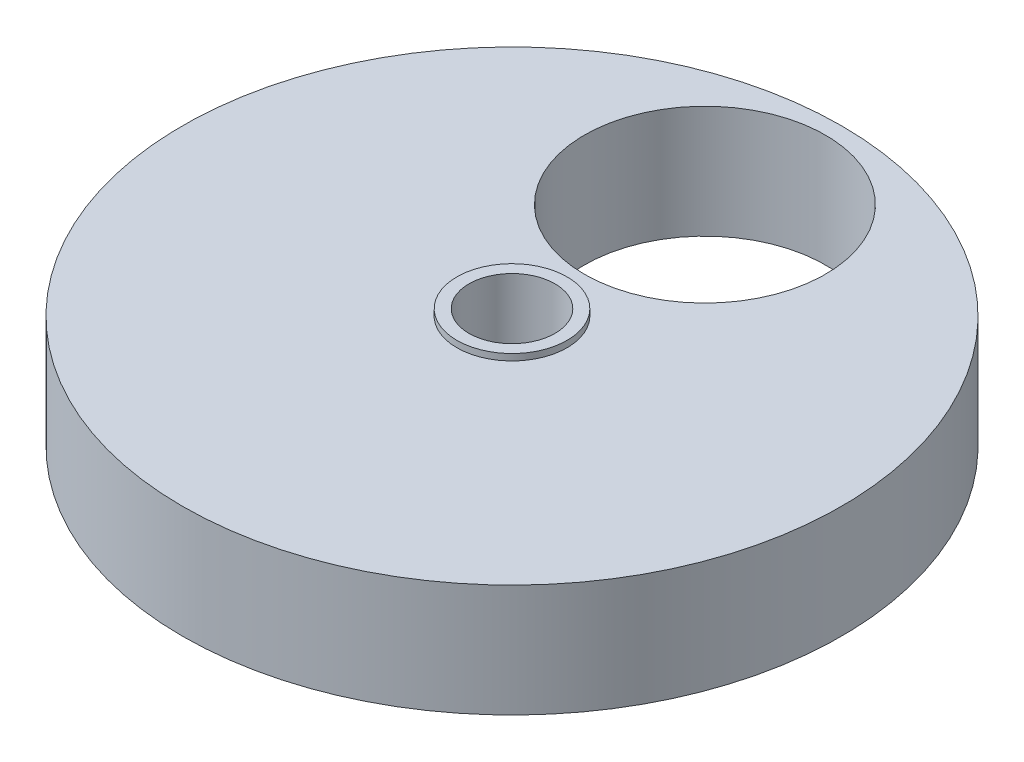
ISO-10303-21;
HEADER;
FILE_DESCRIPTION(('STEP AP214'),'2;1');
FILE_NAME('part.step','',(''),(''),'','','');
FILE_SCHEMA(('AUTOMOTIVE_DESIGN { 1 0 10303 214 1 1 1 1 }'));
ENDSEC;
DATA;
#1=APPLICATION_CONTEXT('core data for automotive mechanical design processes');
#2=APPLICATION_PROTOCOL_DEFINITION('international standard','automotive_design',2000,#1);
#3=PRODUCT_CONTEXT('',#1,'mechanical');
#4=PRODUCT('Part','Part','',(#3));
#5=PRODUCT_RELATED_PRODUCT_CATEGORY('part','',(#4));
#6=PRODUCT_DEFINITION_FORMATION('','',#4);
#7=PRODUCT_DEFINITION_CONTEXT('part definition',#1,'design');
#8=PRODUCT_DEFINITION('design','',#6,#7);
#9=PRODUCT_DEFINITION_SHAPE('','',#8);
#10=(LENGTH_UNIT() NAMED_UNIT(*) SI_UNIT(.MILLI.,.METRE.));
#11=(NAMED_UNIT(*) PLANE_ANGLE_UNIT() SI_UNIT($,.RADIAN.));
#12=(NAMED_UNIT(*) SI_UNIT($,.STERADIAN.) SOLID_ANGLE_UNIT());
#13=UNCERTAINTY_MEASURE_WITH_UNIT(LENGTH_MEASURE(1.E-05),#10,'distance_accuracy_value','');
#14=(GEOMETRIC_REPRESENTATION_CONTEXT(3) GLOBAL_UNCERTAINTY_ASSIGNED_CONTEXT((#13)) GLOBAL_UNIT_ASSIGNED_CONTEXT((#10,
#11,#12)) REPRESENTATION_CONTEXT('',''));
#15=CARTESIAN_POINT('',(0.,0.,0.));
#16=DIRECTION('',(0.,0.,1.));
#17=DIRECTION('',(1.,0.,0.));
#18=AXIS2_PLACEMENT_3D('',#15,#16,#17);
#19=CARTESIAN_POINT('',(0.,7.,0.));
#20=DIRECTION('',(0.,1.,0.));
#21=DIRECTION('',(0.,0.,1.));
#22=AXIS2_PLACEMENT_3D('',#19,#20,#21);
#23=PLANE('',#22);
#24=CARTESIAN_POINT('',(0.,7.,-12.));
#25=DIRECTION('',(0.,1.,0.));
#26=DIRECTION('',(0.,0.,1.));
#27=AXIS2_PLACEMENT_3D('',#24,#25,#26);
#28=CIRCLE('',#27,7.5);
#29=CARTESIAN_POINT('',(0.,7.,-4.5));
#30=VERTEX_POINT('',#29);
#31=EDGE_CURVE('E68',#30,#30,#28,.T.);
#32=ORIENTED_EDGE('',*,*,#31,.F.);
#33=EDGE_LOOP('',(#32));
#34=FACE_BOUND('',#33,.T.);
#35=CARTESIAN_POINT('',(0.,7.,0.));
#36=DIRECTION('',(0.,1.,0.));
#37=DIRECTION('',(0.,0.,1.));
#38=AXIS2_PLACEMENT_3D('',#35,#36,#37);
#39=CIRCLE('',#38,20.5);
#40=CARTESIAN_POINT('',(0.,7.,20.5));
#41=VERTEX_POINT('',#40);
#42=EDGE_CURVE('E10',#41,#41,#39,.T.);
#43=ORIENTED_EDGE('',*,*,#42,.T.);
#44=EDGE_LOOP('',(#43));
#45=FACE_BOUND('',#44,.T.);
#46=CARTESIAN_POINT('',(0.,7.,0.));
#47=DIRECTION('',(0.,1.,0.));
#48=DIRECTION('',(0.,0.,1.));
#49=AXIS2_PLACEMENT_3D('',#46,#47,#48);
#50=CIRCLE('',#49,3.425);
#51=CARTESIAN_POINT('',(0.,7.,3.425));
#52=VERTEX_POINT('',#51);
#53=EDGE_CURVE('E56',#52,#52,#50,.T.);
#54=ORIENTED_EDGE('',*,*,#53,.F.);
#55=EDGE_LOOP('',(#54));
#56=FACE_BOUND('',#55,.T.);
#57=ADVANCED_FACE('F37',(#34,#45,#56),#23,.T.);
#58=CARTESIAN_POINT('',(0.,7.,0.));
#59=DIRECTION('',(0.,-1.,0.));
#60=DIRECTION('',(0.,0.,-1.));
#61=AXIS2_PLACEMENT_3D('',#58,#59,#60);
#62=CYLINDRICAL_SURFACE('',#61,20.5);
#63=ORIENTED_EDGE('',*,*,#42,.F.);
#64=EDGE_LOOP('',(#63));
#65=FACE_BOUND('',#64,.T.);
#66=CARTESIAN_POINT('',(0.,0.,0.));
#67=DIRECTION('',(0.,1.,0.));
#68=DIRECTION('',(0.,0.,1.));
#69=AXIS2_PLACEMENT_3D('',#66,#67,#68);
#70=CIRCLE('',#69,20.5);
#71=CARTESIAN_POINT('',(0.,0.,20.5));
#72=VERTEX_POINT('',#71);
#73=EDGE_CURVE('E41',#72,#72,#70,.T.);
#74=ORIENTED_EDGE('',*,*,#73,.T.);
#75=EDGE_LOOP('',(#74));
#76=FACE_BOUND('',#75,.T.);
#77=ADVANCED_FACE('F39',(#65,#76),#62,.T.);
#78=CARTESIAN_POINT('',(0.,0.,0.));
#79=DIRECTION('',(0.,1.,0.));
#80=DIRECTION('',(0.,0.,1.));
#81=AXIS2_PLACEMENT_3D('',#78,#79,#80);
#82=PLANE('',#81);
#83=CARTESIAN_POINT('',(0.,0.,-12.));
#84=DIRECTION('',(0.,1.,0.));
#85=DIRECTION('',(0.,0.,1.));
#86=AXIS2_PLACEMENT_3D('',#83,#84,#85);
#87=CIRCLE('',#86,7.5);
#88=CARTESIAN_POINT('',(0.,0.,-4.5));
#89=VERTEX_POINT('',#88);
#90=EDGE_CURVE('E67',#89,#89,#87,.T.);
#91=ORIENTED_EDGE('',*,*,#90,.T.);
#92=EDGE_LOOP('',(#91));
#93=FACE_BOUND('',#92,.T.);
#94=CARTESIAN_POINT('',(0.,0.,0.));
#95=DIRECTION('',(0.,1.,0.));
#96=DIRECTION('',(0.,0.,1.));
#97=AXIS2_PLACEMENT_3D('',#94,#95,#96);
#98=CIRCLE('',#97,2.675);
#99=CARTESIAN_POINT('',(0.,0.,2.675));
#100=VERTEX_POINT('',#99);
#101=EDGE_CURVE('E50',#100,#100,#98,.T.);
#102=ORIENTED_EDGE('',*,*,#101,.T.);
#103=EDGE_LOOP('',(#102));
#104=FACE_BOUND('',#103,.T.);
#105=ORIENTED_EDGE('',*,*,#73,.F.);
#106=EDGE_LOOP('',(#105));
#107=FACE_BOUND('',#106,.T.);
#108=ADVANCED_FACE('F76',(#93,#104,#107),#82,.F.);
#109=CARTESIAN_POINT('',(0.,0.,0.));
#110=DIRECTION('',(0.,1.,0.));
#111=DIRECTION('',(0.,0.,1.));
#112=AXIS2_PLACEMENT_3D('',#109,#110,#111);
#113=CYLINDRICAL_SURFACE('',#112,2.675);
#114=ORIENTED_EDGE('',*,*,#101,.F.);
#115=EDGE_LOOP('',(#114));
#116=FACE_BOUND('',#115,.T.);
#117=CARTESIAN_POINT('',(0.,7.4,0.));
#118=DIRECTION('',(0.,1.,0.));
#119=DIRECTION('',(0.,0.,1.));
#120=AXIS2_PLACEMENT_3D('',#117,#118,#119);
#121=CIRCLE('',#120,2.675);
#122=CARTESIAN_POINT('',(0.,7.4,2.675));
#123=VERTEX_POINT('',#122);
#124=EDGE_CURVE('E60',#123,#123,#121,.T.);
#125=ORIENTED_EDGE('',*,*,#124,.T.);
#126=EDGE_LOOP('',(#125));
#127=FACE_BOUND('',#126,.T.);
#128=ADVANCED_FACE('F98',(#116,#127),#113,.F.);
#129=CARTESIAN_POINT('',(0.,7.4,0.));
#130=DIRECTION('',(0.,1.,0.));
#131=DIRECTION('',(0.,0.,1.));
#132=AXIS2_PLACEMENT_3D('',#129,#130,#131);
#133=PLANE('',#132);
#134=CARTESIAN_POINT('',(0.,7.4,0.));
#135=DIRECTION('',(0.,1.,0.));
#136=DIRECTION('',(0.,0.,1.));
#137=AXIS2_PLACEMENT_3D('',#134,#135,#136);
#138=CIRCLE('',#137,3.425);
#139=CARTESIAN_POINT('',(0.,7.4,3.425));
#140=VERTEX_POINT('',#139);
#141=EDGE_CURVE('E55',#140,#140,#138,.T.);
#142=ORIENTED_EDGE('',*,*,#141,.T.);
#143=EDGE_LOOP('',(#142));
#144=FACE_BOUND('',#143,.T.);
#145=ORIENTED_EDGE('',*,*,#124,.F.);
#146=EDGE_LOOP('',(#145));
#147=FACE_BOUND('',#146,.T.);
#148=ADVANCED_FACE('F92',(#144,#147),#133,.T.);
#149=CARTESIAN_POINT('',(0.,7.4,0.));
#150=DIRECTION('',(0.,-1.,0.));
#151=DIRECTION('',(0.,0.,-1.));
#152=AXIS2_PLACEMENT_3D('',#149,#150,#151);
#153=CYLINDRICAL_SURFACE('',#152,3.425);
#154=ORIENTED_EDGE('',*,*,#141,.F.);
#155=EDGE_LOOP('',(#154));
#156=FACE_BOUND('',#155,.T.);
#157=ORIENTED_EDGE('',*,*,#53,.T.);
#158=EDGE_LOOP('',(#157));
#159=FACE_BOUND('',#158,.T.);
#160=ADVANCED_FACE('F82',(#156,#159),#153,.T.);
#161=CARTESIAN_POINT('',(0.,0.,-12.));
#162=DIRECTION('',(0.,1.,0.));
#163=DIRECTION('',(0.,0.,1.));
#164=AXIS2_PLACEMENT_3D('',#161,#162,#163);
#165=CYLINDRICAL_SURFACE('',#164,7.5);
#166=ORIENTED_EDGE('',*,*,#90,.F.);
#167=EDGE_LOOP('',(#166));
#168=FACE_BOUND('',#167,.T.);
#169=ORIENTED_EDGE('',*,*,#31,.T.);
#170=EDGE_LOOP('',(#169));
#171=FACE_BOUND('',#170,.T.);
#172=ADVANCED_FACE('F79',(#168,#171),#165,.F.);
#173=CLOSED_SHELL('',(#57,#77,#108,#128,#148,#160,#172));
#174=MANIFOLD_SOLID_BREP('B2',#173);
#175=ADVANCED_BREP_SHAPE_REPRESENTATION('',(#18,#174),#14);
#176=SHAPE_DEFINITION_REPRESENTATION(#9,#175);
ENDSEC;
END-ISO-10303-21;
